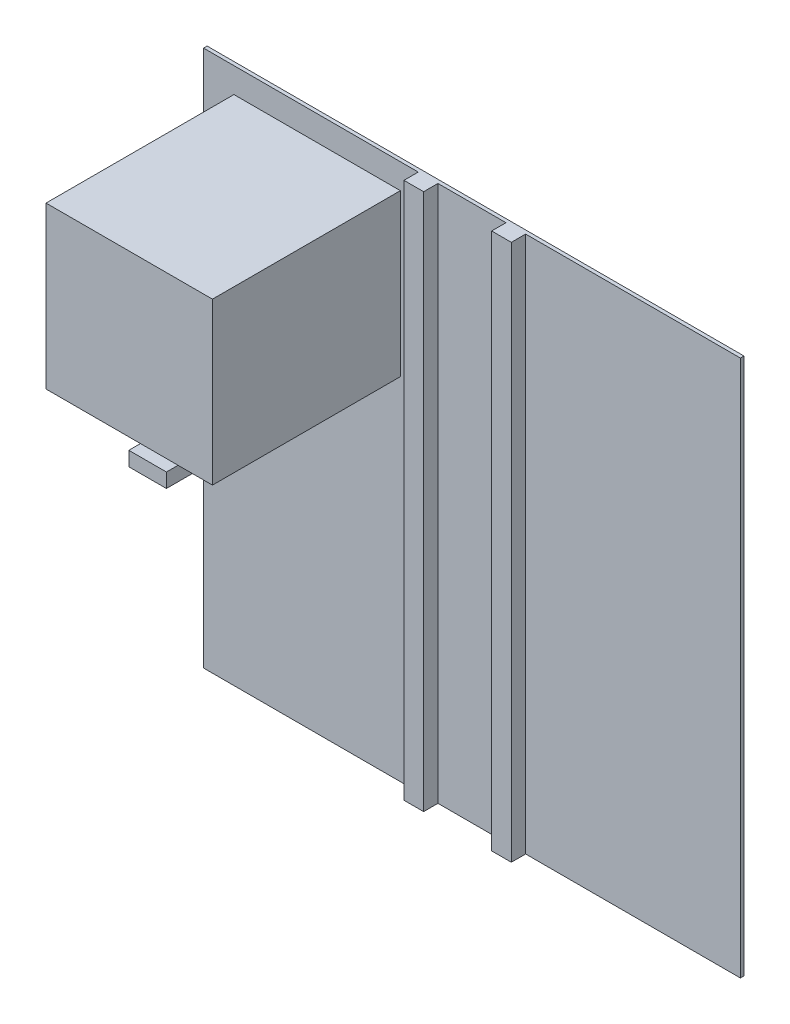
ISO-10303-21;
HEADER;
FILE_DESCRIPTION(('STEP AP214'),'2;1');
FILE_NAME('part.step','',(''),(''),'','','');
FILE_SCHEMA(('AUTOMOTIVE_DESIGN { 1 0 10303 214 1 1 1 1 }'));
ENDSEC;
DATA;
#1=APPLICATION_CONTEXT('core data for automotive mechanical design processes');
#2=APPLICATION_PROTOCOL_DEFINITION('international standard','automotive_design',2000,#1);
#3=PRODUCT_CONTEXT('',#1,'mechanical');
#4=PRODUCT('Part','Part','',(#3));
#5=PRODUCT_RELATED_PRODUCT_CATEGORY('part','',(#4));
#6=PRODUCT_DEFINITION_FORMATION('','',#4);
#7=PRODUCT_DEFINITION_CONTEXT('part definition',#1,'design');
#8=PRODUCT_DEFINITION('design','',#6,#7);
#9=PRODUCT_DEFINITION_SHAPE('','',#8);
#10=(LENGTH_UNIT() NAMED_UNIT(*) SI_UNIT(.MILLI.,.METRE.));
#11=(NAMED_UNIT(*) PLANE_ANGLE_UNIT() SI_UNIT($,.RADIAN.));
#12=(NAMED_UNIT(*) SI_UNIT($,.STERADIAN.) SOLID_ANGLE_UNIT());
#13=UNCERTAINTY_MEASURE_WITH_UNIT(LENGTH_MEASURE(1.E-05),#10,'distance_accuracy_value','');
#14=(GEOMETRIC_REPRESENTATION_CONTEXT(3) GLOBAL_UNCERTAINTY_ASSIGNED_CONTEXT((#13)) GLOBAL_UNIT_ASSIGNED_CONTEXT((#10,
#11,#12)) REPRESENTATION_CONTEXT('',''));
#15=CARTESIAN_POINT('',(0.,0.,0.));
#16=DIRECTION('',(0.,0.,1.));
#17=DIRECTION('',(1.,0.,0.));
#18=AXIS2_PLACEMENT_3D('',#15,#16,#17);
#19=CARTESIAN_POINT('',(0.,0.,10.));
#20=DIRECTION('',(0.,0.,1.));
#21=DIRECTION('',(1.,0.,0.));
#22=AXIS2_PLACEMENT_3D('',#19,#20,#21);
#23=PLANE('',#22);
#24=DIRECTION('',(-1.,0.,0.));
#25=VECTOR('',#24,1.);
#26=CARTESIAN_POINT('',(-1500.,1500.,10.));
#27=LINE('',#26,#25);
#28=CARTESIAN_POINT('',(-2.22044604925031E-13,1500.,10.));
#29=VERTEX_POINT('',#28);
#30=CARTESIAN_POINT('',(-600.,1500.,10.));
#31=VERTEX_POINT('',#30);
#32=EDGE_CURVE('E216',#29,#31,#27,.T.);
#33=ORIENTED_EDGE('',*,*,#32,.T.);
#34=DIRECTION('',(0.,1.,0.));
#35=VECTOR('',#34,1.);
#36=CARTESIAN_POINT('',(-600.,1500.,10.));
#37=LINE('',#36,#35);
#38=CARTESIAN_POINT('',(-600.,0.,10.));
#39=VERTEX_POINT('',#38);
#40=EDGE_CURVE('E54',#39,#31,#37,.T.);
#41=ORIENTED_EDGE('',*,*,#40,.F.);
#42=DIRECTION('',(1.,0.,0.));
#43=VECTOR('',#42,1.);
#44=CARTESIAN_POINT('',(-1500.,0.,10.));
#45=LINE('',#44,#43);
#46=CARTESIAN_POINT('',(0.,0.,10.));
#47=VERTEX_POINT('',#46);
#48=EDGE_CURVE('E361',#39,#47,#45,.T.);
#49=ORIENTED_EDGE('',*,*,#48,.T.);
#50=DIRECTION('',(0.,1.,0.));
#51=VECTOR('',#50,1.);
#52=CARTESIAN_POINT('',(-2.22044604925031E-13,1500.,10.));
#53=LINE('',#52,#51);
#54=EDGE_CURVE('E365',#47,#29,#53,.T.);
#55=ORIENTED_EDGE('',*,*,#54,.T.);
#56=EDGE_LOOP('',(#33,#41,#49,#55));
#57=FACE_BOUND('',#56,.T.);
#58=ADVANCED_FACE('F39',(#57),#23,.T.);
#59=CARTESIAN_POINT('',(-845.,0.,10.));
#60=VERTEX_POINT('',#59);
#61=CARTESIAN_POINT('',(-655.,0.,10.));
#62=VERTEX_POINT('',#61);
#63=EDGE_CURVE('E62',#60,#62,#45,.T.);
#64=ORIENTED_EDGE('',*,*,#63,.T.);
#65=DIRECTION('',(0.,-1.,0.));
#66=VECTOR('',#65,1.);
#67=CARTESIAN_POINT('',(-655.,1500.,10.));
#68=LINE('',#67,#66);
#69=CARTESIAN_POINT('',(-655.,1500.,10.));
#70=VERTEX_POINT('',#69);
#71=EDGE_CURVE('E219',#70,#62,#68,.T.);
#72=ORIENTED_EDGE('',*,*,#71,.F.);
#73=CARTESIAN_POINT('',(-845.,1500.,10.));
#74=VERTEX_POINT('',#73);
#75=EDGE_CURVE('E207',#70,#74,#27,.T.);
#76=ORIENTED_EDGE('',*,*,#75,.T.);
#77=DIRECTION('',(0.,1.,0.));
#78=VECTOR('',#77,1.);
#79=CARTESIAN_POINT('',(-845.,1500.,10.));
#80=LINE('',#79,#78);
#81=EDGE_CURVE('E251',#60,#74,#80,.T.);
#82=ORIENTED_EDGE('',*,*,#81,.F.);
#83=EDGE_LOOP('',(#64,#72,#76,#82));
#84=FACE_BOUND('',#83,.T.);
#85=ADVANCED_FACE('F220',(#84),#23,.T.);
#86=DIRECTION('',(1.,0.,0.));
#87=VECTOR('',#86,1.);
#88=CARTESIAN_POINT('',(-1151.1239217096,940.,10.));
#89=LINE('',#88,#87);
#90=CARTESIAN_POINT('',(-1151.1239217096,940.,10.));
#91=VERTEX_POINT('',#90);
#92=CARTESIAN_POINT('',(-1046.1239217096,940.,10.));
#93=VERTEX_POINT('',#92);
#94=EDGE_CURVE('E299',#91,#93,#89,.T.);
#95=ORIENTED_EDGE('',*,*,#94,.F.);
#96=DIRECTION('',(0.,1.,0.));
#97=VECTOR('',#96,1.);
#98=CARTESIAN_POINT('',(-1151.1239217096,940.,10.));
#99=LINE('',#98,#97);
#100=CARTESIAN_POINT('',(-1151.1239217096,980.,10.));
#101=VERTEX_POINT('',#100);
#102=EDGE_CURVE('E317',#91,#101,#99,.T.);
#103=ORIENTED_EDGE('',*,*,#102,.T.);
#104=DIRECTION('',(1.,0.,0.));
#105=VECTOR('',#104,1.);
#106=CARTESIAN_POINT('',(-1415.,980.,10.));
#107=LINE('',#106,#105);
#108=CARTESIAN_POINT('',(-1415.,980.,10.));
#109=VERTEX_POINT('',#108);
#110=EDGE_CURVE('E341',#109,#101,#107,.T.);
#111=ORIENTED_EDGE('',*,*,#110,.F.);
#112=DIRECTION('',(0.,-1.,0.));
#113=VECTOR('',#112,1.);
#114=CARTESIAN_POINT('',(-1415.,1430.,10.));
#115=LINE('',#114,#113);
#116=CARTESIAN_POINT('',(-1415.,1430.,10.));
#117=VERTEX_POINT('',#116);
#118=EDGE_CURVE('E316',#117,#109,#115,.T.);
#119=ORIENTED_EDGE('',*,*,#118,.F.);
#120=DIRECTION('',(-1.,0.,0.));
#121=VECTOR('',#120,1.);
#122=CARTESIAN_POINT('',(-1415.,1430.,10.));
#123=LINE('',#122,#121);
#124=CARTESIAN_POINT('',(-950.000000000001,1430.,10.));
#125=VERTEX_POINT('',#124);
#126=EDGE_CURVE('E328',#125,#117,#123,.T.);
#127=ORIENTED_EDGE('',*,*,#126,.F.);
#128=DIRECTION('',(0.,1.,0.));
#129=VECTOR('',#128,1.);
#130=CARTESIAN_POINT('',(-950.000000000001,1430.,10.));
#131=LINE('',#130,#129);
#132=CARTESIAN_POINT('',(-950.000000000001,980.,10.));
#133=VERTEX_POINT('',#132);
#134=EDGE_CURVE('E344',#133,#125,#131,.T.);
#135=ORIENTED_EDGE('',*,*,#134,.F.);
#136=CARTESIAN_POINT('',(-1046.1239217096,980.,10.));
#137=VERTEX_POINT('',#136);
#138=EDGE_CURVE('E340',#137,#133,#107,.T.);
#139=ORIENTED_EDGE('',*,*,#138,.F.);
#140=DIRECTION('',(0.,1.,0.));
#141=VECTOR('',#140,1.);
#142=CARTESIAN_POINT('',(-1046.1239217096,940.,10.));
#143=LINE('',#142,#141);
#144=EDGE_CURVE('E320',#93,#137,#143,.T.);
#145=ORIENTED_EDGE('',*,*,#144,.F.);
#146=EDGE_LOOP('',(#95,#103,#111,#119,#127,#135,#139,#145));
#147=FACE_BOUND('',#146,.T.);
#148=CARTESIAN_POINT('',(-1500.,0.,10.));
#149=VERTEX_POINT('',#148);
#150=CARTESIAN_POINT('',(-900.,0.,10.));
#151=VERTEX_POINT('',#150);
#152=EDGE_CURVE('E363',#149,#151,#45,.T.);
#153=ORIENTED_EDGE('',*,*,#152,.T.);
#154=DIRECTION('',(0.,-1.,0.));
#155=VECTOR('',#154,1.);
#156=CARTESIAN_POINT('',(-900.,1500.,10.));
#157=LINE('',#156,#155);
#158=CARTESIAN_POINT('',(-900.,1500.,10.));
#159=VERTEX_POINT('',#158);
#160=EDGE_CURVE('E240',#159,#151,#157,.T.);
#161=ORIENTED_EDGE('',*,*,#160,.F.);
#162=CARTESIAN_POINT('',(-1500.,1500.,10.));
#163=VERTEX_POINT('',#162);
#164=EDGE_CURVE('E217',#159,#163,#27,.T.);
#165=ORIENTED_EDGE('',*,*,#164,.T.);
#166=DIRECTION('',(0.,-1.,0.));
#167=VECTOR('',#166,1.);
#168=CARTESIAN_POINT('',(-1500.,1500.,10.));
#169=LINE('',#168,#167);
#170=EDGE_CURVE('E358',#163,#149,#169,.T.);
#171=ORIENTED_EDGE('',*,*,#170,.T.);
#172=EDGE_LOOP('',(#153,#161,#165,#171));
#173=FACE_BOUND('',#172,.T.);
#174=ADVANCED_FACE('F409',(#147,#173),#23,.T.);
#175=CARTESIAN_POINT('',(0.,940.,0.));
#176=DIRECTION('',(0.,1.,0.));
#177=DIRECTION('',(0.,0.,1.));
#178=AXIS2_PLACEMENT_3D('',#175,#176,#177);
#179=PLANE('',#178);
#180=CARTESIAN_POINT('',(-1098.6239217096,940.,272.5));
#181=DIRECTION('',(0.,1.,0.));
#182=DIRECTION('',(0.,0.,1.));
#183=AXIS2_PLACEMENT_3D('',#180,#181,#182);
#184=CIRCLE('',#183,84.9999999999999);
#185=CARTESIAN_POINT('',(-1046.1239217096,940.,339.348709785605));
#186=VERTEX_POINT('',#185);
#187=CARTESIAN_POINT('',(-1151.1239217096,940.,339.348709785605));
#188=VERTEX_POINT('',#187);
#189=EDGE_CURVE('E11',#186,#188,#184,.F.);
#190=ORIENTED_EDGE('',*,*,#189,.F.);
#191=DIRECTION('',(0.,0.,-1.));
#192=VECTOR('',#191,1.);
#193=CARTESIAN_POINT('',(-1046.1239217096,940.,567.5));
#194=LINE('',#193,#192);
#195=CARTESIAN_POINT('',(-1046.1239217096,940.,567.5));
#196=VERTEX_POINT('',#195);
#197=EDGE_CURVE('E296',#196,#186,#194,.T.);
#198=ORIENTED_EDGE('',*,*,#197,.F.);
#199=DIRECTION('',(1.,0.,0.));
#200=VECTOR('',#199,1.);
#201=CARTESIAN_POINT('',(-1151.1239217096,940.,567.5));
#202=LINE('',#201,#200);
#203=CARTESIAN_POINT('',(-1151.1239217096,940.,567.5));
#204=VERTEX_POINT('',#203);
#205=EDGE_CURVE('E291',#204,#196,#202,.T.);
#206=ORIENTED_EDGE('',*,*,#205,.F.);
#207=DIRECTION('',(0.,0.,-1.));
#208=VECTOR('',#207,1.);
#209=CARTESIAN_POINT('',(-1151.1239217096,940.,567.5));
#210=LINE('',#209,#208);
#211=EDGE_CURVE('E303',#204,#188,#210,.T.);
#212=ORIENTED_EDGE('',*,*,#211,.T.);
#213=EDGE_LOOP('',(#190,#198,#206,#212));
#214=FACE_BOUND('',#213,.T.);
#215=ADVANCED_FACE('F462',(#214),#179,.F.);
#216=CARTESIAN_POINT('',(-1415.,980.,535.));
#217=DIRECTION('',(0.,1.,0.));
#218=DIRECTION('',(0.,0.,1.));
#219=AXIS2_PLACEMENT_3D('',#216,#217,#218);
#220=PLANE('',#219);
#221=DIRECTION('',(0.,0.,-1.));
#222=VECTOR('',#221,1.);
#223=CARTESIAN_POINT('',(-1151.1239217096,980.,567.5));
#224=LINE('',#223,#222);
#225=CARTESIAN_POINT('',(-1151.1239217096,980.,535.));
#226=VERTEX_POINT('',#225);
#227=EDGE_CURVE('E311',#226,#101,#224,.T.);
#228=ORIENTED_EDGE('',*,*,#227,.F.);
#229=DIRECTION('',(1.,0.,0.));
#230=VECTOR('',#229,1.);
#231=CARTESIAN_POINT('',(-1415.,980.,535.));
#232=LINE('',#231,#230);
#233=CARTESIAN_POINT('',(-1415.,980.,535.));
#234=VERTEX_POINT('',#233);
#235=EDGE_CURVE('E329',#234,#226,#232,.T.);
#236=ORIENTED_EDGE('',*,*,#235,.F.);
#237=DIRECTION('',(0.,0.,-1.));
#238=VECTOR('',#237,1.);
#239=CARTESIAN_POINT('',(-1415.,980.,535.));
#240=LINE('',#239,#238);
#241=EDGE_CURVE('E355',#234,#109,#240,.T.);
#242=ORIENTED_EDGE('',*,*,#241,.T.);
#243=ORIENTED_EDGE('',*,*,#110,.T.);
#244=EDGE_LOOP('',(#228,#236,#242,#243));
#245=FACE_BOUND('',#244,.T.);
#246=ADVANCED_FACE('F429',(#245),#220,.F.);
#247=CARTESIAN_POINT('',(-1500.,1500.,10.));
#248=DIRECTION('',(1.,0.,0.));
#249=DIRECTION('',(0.,0.,-1.));
#250=AXIS2_PLACEMENT_3D('',#247,#248,#249);
#251=PLANE('',#250);
#252=DIRECTION('',(0.,-1.,0.));
#253=VECTOR('',#252,1.);
#254=CARTESIAN_POINT('',(-1500.,1500.,0.));
#255=LINE('',#254,#253);
#256=CARTESIAN_POINT('',(-1500.,1500.,0.));
#257=VERTEX_POINT('',#256);
#258=CARTESIAN_POINT('',(-1500.,0.,0.));
#259=VERTEX_POINT('',#258);
#260=EDGE_CURVE('E357',#257,#259,#255,.T.);
#261=ORIENTED_EDGE('',*,*,#260,.T.);
#262=DIRECTION('',(0.,0.,-1.));
#263=VECTOR('',#262,1.);
#264=CARTESIAN_POINT('',(-1500.,0.,10.));
#265=LINE('',#264,#263);
#266=EDGE_CURVE('E383',#149,#259,#265,.T.);
#267=ORIENTED_EDGE('',*,*,#266,.F.);
#268=ORIENTED_EDGE('',*,*,#170,.F.);
#269=DIRECTION('',(0.,0.,-1.));
#270=VECTOR('',#269,1.);
#271=CARTESIAN_POINT('',(-1500.,1500.,10.));
#272=LINE('',#271,#270);
#273=EDGE_CURVE('E367',#163,#257,#272,.T.);
#274=ORIENTED_EDGE('',*,*,#273,.T.);
#275=EDGE_LOOP('',(#261,#267,#268,#274));
#276=FACE_BOUND('',#275,.T.);
#277=ADVANCED_FACE('F41',(#276),#251,.F.);
#278=CARTESIAN_POINT('',(-1500.,0.,10.));
#279=DIRECTION('',(0.,1.,0.));
#280=DIRECTION('',(0.,0.,1.));
#281=AXIS2_PLACEMENT_3D('',#278,#279,#280);
#282=PLANE('',#281);
#283=DIRECTION('',(1.,0.,0.));
#284=VECTOR('',#283,1.);
#285=CARTESIAN_POINT('',(-1500.,0.,0.));
#286=LINE('',#285,#284);
#287=CARTESIAN_POINT('',(0.,0.,0.));
#288=VERTEX_POINT('',#287);
#289=EDGE_CURVE('E370',#259,#288,#286,.T.);
#290=ORIENTED_EDGE('',*,*,#289,.T.);
#291=DIRECTION('',(0.,0.,-1.));
#292=VECTOR('',#291,1.);
#293=CARTESIAN_POINT('',(0.,0.,10.));
#294=LINE('',#293,#292);
#295=EDGE_CURVE('E380',#47,#288,#294,.T.);
#296=ORIENTED_EDGE('',*,*,#295,.F.);
#297=ORIENTED_EDGE('',*,*,#48,.F.);
#298=DIRECTION('',(0.,0.,-1.));
#299=VECTOR('',#298,1.);
#300=CARTESIAN_POINT('',(-600.,0.,50.));
#301=LINE('',#300,#299);
#302=CARTESIAN_POINT('',(-600.,0.,50.));
#303=VERTEX_POINT('',#302);
#304=EDGE_CURVE('E231',#303,#39,#301,.T.);
#305=ORIENTED_EDGE('',*,*,#304,.F.);
#306=DIRECTION('',(1.,0.,0.));
#307=VECTOR('',#306,1.);
#308=CARTESIAN_POINT('',(-600.,0.,50.));
#309=LINE('',#308,#307);
#310=CARTESIAN_POINT('',(-655.,0.,50.));
#311=VERTEX_POINT('',#310);
#312=EDGE_CURVE('E237',#311,#303,#309,.T.);
#313=ORIENTED_EDGE('',*,*,#312,.F.);
#314=DIRECTION('',(0.,0.,-1.));
#315=VECTOR('',#314,1.);
#316=CARTESIAN_POINT('',(-655.,0.,50.));
#317=LINE('',#316,#315);
#318=EDGE_CURVE('E228',#311,#62,#317,.T.);
#319=ORIENTED_EDGE('',*,*,#318,.T.);
#320=ORIENTED_EDGE('',*,*,#63,.F.);
#321=DIRECTION('',(0.,0.,-1.));
#322=VECTOR('',#321,1.);
#323=CARTESIAN_POINT('',(-845.,0.,50.));
#324=LINE('',#323,#322);
#325=CARTESIAN_POINT('',(-845.,0.,50.));
#326=VERTEX_POINT('',#325);
#327=EDGE_CURVE('E264',#326,#60,#324,.T.);
#328=ORIENTED_EDGE('',*,*,#327,.F.);
#329=DIRECTION('',(1.,0.,0.));
#330=VECTOR('',#329,1.);
#331=CARTESIAN_POINT('',(-900.,0.,50.));
#332=LINE('',#331,#330);
#333=CARTESIAN_POINT('',(-900.,0.,50.));
#334=VERTEX_POINT('',#333);
#335=EDGE_CURVE('E250',#334,#326,#332,.T.);
#336=ORIENTED_EDGE('',*,*,#335,.F.);
#337=DIRECTION('',(0.,0.,-1.));
#338=VECTOR('',#337,1.);
#339=CARTESIAN_POINT('',(-900.,0.,50.));
#340=LINE('',#339,#338);
#341=EDGE_CURVE('E267',#334,#151,#340,.T.);
#342=ORIENTED_EDGE('',*,*,#341,.T.);
#343=ORIENTED_EDGE('',*,*,#152,.F.);
#344=ORIENTED_EDGE('',*,*,#266,.T.);
#345=EDGE_LOOP('',(#290,#296,#297,#305,#313,#319,#320,#328,#336,#342,#343,#344));
#346=FACE_BOUND('',#345,.T.);
#347=ADVANCED_FACE('F570',(#346),#282,.F.);
#348=CARTESIAN_POINT('',(-2.22044604925031E-13,1500.,10.));
#349=DIRECTION('',(-1.,0.,0.));
#350=DIRECTION('',(0.,-1.,0.));
#351=AXIS2_PLACEMENT_3D('',#348,#349,#350);
#352=PLANE('',#351);
#353=DIRECTION('',(0.,1.,0.));
#354=VECTOR('',#353,1.);
#355=CARTESIAN_POINT('',(-2.22044604925031E-13,1500.,0.));
#356=LINE('',#355,#354);
#357=CARTESIAN_POINT('',(-2.22044604925031E-13,1500.,0.));
#358=VERTEX_POINT('',#357);
#359=EDGE_CURVE('E372',#288,#358,#356,.T.);
#360=ORIENTED_EDGE('',*,*,#359,.T.);
#361=DIRECTION('',(0.,0.,-1.));
#362=VECTOR('',#361,1.);
#363=CARTESIAN_POINT('',(-2.22044604925031E-13,1500.,10.));
#364=LINE('',#363,#362);
#365=EDGE_CURVE('E377',#29,#358,#364,.T.);
#366=ORIENTED_EDGE('',*,*,#365,.F.);
#367=ORIENTED_EDGE('',*,*,#54,.F.);
#368=ORIENTED_EDGE('',*,*,#295,.T.);
#369=EDGE_LOOP('',(#360,#366,#367,#368));
#370=FACE_BOUND('',#369,.T.);
#371=ADVANCED_FACE('F575',(#370),#352,.F.);
#372=CARTESIAN_POINT('',(-1500.,1500.,10.));
#373=DIRECTION('',(0.,-1.,0.));
#374=DIRECTION('',(1.,0.,0.));
#375=AXIS2_PLACEMENT_3D('',#372,#373,#374);
#376=PLANE('',#375);
#377=DIRECTION('',(-1.,0.,0.));
#378=VECTOR('',#377,1.);
#379=CARTESIAN_POINT('',(-1500.,1500.,0.));
#380=LINE('',#379,#378);
#381=EDGE_CURVE('E362',#358,#257,#380,.T.);
#382=ORIENTED_EDGE('',*,*,#381,.T.);
#383=ORIENTED_EDGE('',*,*,#273,.F.);
#384=ORIENTED_EDGE('',*,*,#164,.F.);
#385=DIRECTION('',(0.,0.,-1.));
#386=VECTOR('',#385,1.);
#387=CARTESIAN_POINT('',(-900.,1500.,50.));
#388=LINE('',#387,#386);
#389=CARTESIAN_POINT('',(-900.,1500.,50.));
#390=VERTEX_POINT('',#389);
#391=EDGE_CURVE('E257',#390,#159,#388,.T.);
#392=ORIENTED_EDGE('',*,*,#391,.F.);
#393=DIRECTION('',(-1.,0.,0.));
#394=VECTOR('',#393,1.);
#395=CARTESIAN_POINT('',(-900.,1500.,50.));
#396=LINE('',#395,#394);
#397=CARTESIAN_POINT('',(-845.,1500.,50.));
#398=VERTEX_POINT('',#397);
#399=EDGE_CURVE('E255',#398,#390,#396,.T.);
#400=ORIENTED_EDGE('',*,*,#399,.F.);
#401=DIRECTION('',(0.,0.,-1.));
#402=VECTOR('',#401,1.);
#403=CARTESIAN_POINT('',(-845.,1500.,50.));
#404=LINE('',#403,#402);
#405=EDGE_CURVE('E214',#398,#74,#404,.T.);
#406=ORIENTED_EDGE('',*,*,#405,.T.);
#407=ORIENTED_EDGE('',*,*,#75,.F.);
#408=DIRECTION('',(0.,0.,-1.));
#409=VECTOR('',#408,1.);
#410=CARTESIAN_POINT('',(-655.,1500.,50.));
#411=LINE('',#410,#409);
#412=CARTESIAN_POINT('',(-655.,1500.,50.));
#413=VERTEX_POINT('',#412);
#414=EDGE_CURVE('E210',#413,#70,#411,.T.);
#415=ORIENTED_EDGE('',*,*,#414,.F.);
#416=DIRECTION('',(-1.,0.,0.));
#417=VECTOR('',#416,1.);
#418=CARTESIAN_POINT('',(-600.,1500.,50.));
#419=LINE('',#418,#417);
#420=CARTESIAN_POINT('',(-600.,1500.,50.));
#421=VERTEX_POINT('',#420);
#422=EDGE_CURVE('E243',#421,#413,#419,.T.);
#423=ORIENTED_EDGE('',*,*,#422,.F.);
#424=DIRECTION('',(0.,0.,-1.));
#425=VECTOR('',#424,1.);
#426=CARTESIAN_POINT('',(-600.,1500.,50.));
#427=LINE('',#426,#425);
#428=EDGE_CURVE('E229',#421,#31,#427,.T.);
#429=ORIENTED_EDGE('',*,*,#428,.T.);
#430=ORIENTED_EDGE('',*,*,#32,.F.);
#431=ORIENTED_EDGE('',*,*,#365,.T.);
#432=EDGE_LOOP('',(#382,#383,#384,#392,#400,#406,#407,#415,#423,#429,#430,#431));
#433=FACE_BOUND('',#432,.T.);
#434=ADVANCED_FACE('F208',(#433),#376,.F.);
#435=CARTESIAN_POINT('',(0.,0.,0.));
#436=DIRECTION('',(0.,0.,1.));
#437=DIRECTION('',(1.,0.,0.));
#438=AXIS2_PLACEMENT_3D('',#435,#436,#437);
#439=PLANE('',#438);
#440=ORIENTED_EDGE('',*,*,#260,.F.);
#441=ORIENTED_EDGE('',*,*,#381,.F.);
#442=ORIENTED_EDGE('',*,*,#359,.F.);
#443=ORIENTED_EDGE('',*,*,#289,.F.);
#444=EDGE_LOOP('',(#440,#441,#442,#443));
#445=FACE_BOUND('',#444,.T.);
#446=ADVANCED_FACE('F591',(#445),#439,.F.);
#447=CARTESIAN_POINT('',(-1415.,1430.,535.));
#448=DIRECTION('',(1.,0.,0.));
#449=DIRECTION('',(0.,0.,-1.));
#450=AXIS2_PLACEMENT_3D('',#447,#448,#449);
#451=PLANE('',#450);
#452=ORIENTED_EDGE('',*,*,#118,.T.);
#453=ORIENTED_EDGE('',*,*,#241,.F.);
#454=DIRECTION('',(0.,-1.,0.));
#455=VECTOR('',#454,1.);
#456=CARTESIAN_POINT('',(-1415.,1430.,535.));
#457=LINE('',#456,#455);
#458=CARTESIAN_POINT('',(-1415.,1430.,535.));
#459=VERTEX_POINT('',#458);
#460=EDGE_CURVE('E324',#459,#234,#457,.T.);
#461=ORIENTED_EDGE('',*,*,#460,.F.);
#462=DIRECTION('',(0.,0.,-1.));
#463=VECTOR('',#462,1.);
#464=CARTESIAN_POINT('',(-1415.,1430.,535.));
#465=LINE('',#464,#463);
#466=EDGE_CURVE('E337',#459,#117,#465,.T.);
#467=ORIENTED_EDGE('',*,*,#466,.T.);
#468=EDGE_LOOP('',(#452,#453,#461,#467));
#469=FACE_BOUND('',#468,.T.);
#470=ADVANCED_FACE('F435',(#469),#451,.F.);
#471=CARTESIAN_POINT('',(-1046.1239217096,980.,535.));
#472=VERTEX_POINT('',#471);
#473=CARTESIAN_POINT('',(-950.000000000001,980.,535.));
#474=VERTEX_POINT('',#473);
#475=EDGE_CURVE('E327',#472,#474,#232,.T.);
#476=ORIENTED_EDGE('',*,*,#475,.F.);
#477=DIRECTION('',(0.,0.,-1.));
#478=VECTOR('',#477,1.);
#479=CARTESIAN_POINT('',(-1046.1239217096,980.,567.5));
#480=LINE('',#479,#478);
#481=EDGE_CURVE('E308',#472,#137,#480,.T.);
#482=ORIENTED_EDGE('',*,*,#481,.T.);
#483=ORIENTED_EDGE('',*,*,#138,.T.);
#484=DIRECTION('',(0.,0.,-1.));
#485=VECTOR('',#484,1.);
#486=CARTESIAN_POINT('',(-950.000000000001,980.,535.));
#487=LINE('',#486,#485);
#488=EDGE_CURVE('E352',#474,#133,#487,.T.);
#489=ORIENTED_EDGE('',*,*,#488,.F.);
#490=EDGE_LOOP('',(#476,#482,#483,#489));
#491=FACE_BOUND('',#490,.T.);
#492=ADVANCED_FACE('F418',(#491),#220,.F.);
#493=CARTESIAN_POINT('',(-950.000000000001,1430.,535.));
#494=DIRECTION('',(-1.,0.,0.));
#495=DIRECTION('',(0.,0.,1.));
#496=AXIS2_PLACEMENT_3D('',#493,#494,#495);
#497=PLANE('',#496);
#498=ORIENTED_EDGE('',*,*,#134,.T.);
#499=DIRECTION('',(0.,0.,-1.));
#500=VECTOR('',#499,1.);
#501=CARTESIAN_POINT('',(-950.000000000001,1430.,535.));
#502=LINE('',#501,#500);
#503=CARTESIAN_POINT('',(-950.000000000001,1430.,535.));
#504=VERTEX_POINT('',#503);
#505=EDGE_CURVE('E350',#504,#125,#502,.T.);
#506=ORIENTED_EDGE('',*,*,#505,.F.);
#507=DIRECTION('',(0.,1.,0.));
#508=VECTOR('',#507,1.);
#509=CARTESIAN_POINT('',(-950.000000000001,1430.,535.));
#510=LINE('',#509,#508);
#511=EDGE_CURVE('E332',#474,#504,#510,.T.);
#512=ORIENTED_EDGE('',*,*,#511,.F.);
#513=ORIENTED_EDGE('',*,*,#488,.T.);
#514=EDGE_LOOP('',(#498,#506,#512,#513));
#515=FACE_BOUND('',#514,.T.);
#516=ADVANCED_FACE('F443',(#515),#497,.F.);
#517=CARTESIAN_POINT('',(-1415.,1430.,535.));
#518=DIRECTION('',(0.,-1.,0.));
#519=DIRECTION('',(0.,0.,-1.));
#520=AXIS2_PLACEMENT_3D('',#517,#518,#519);
#521=PLANE('',#520);
#522=ORIENTED_EDGE('',*,*,#126,.T.);
#523=ORIENTED_EDGE('',*,*,#466,.F.);
#524=DIRECTION('',(-1.,0.,0.));
#525=VECTOR('',#524,1.);
#526=CARTESIAN_POINT('',(-1415.,1430.,535.));
#527=LINE('',#526,#525);
#528=EDGE_CURVE('E335',#504,#459,#527,.T.);
#529=ORIENTED_EDGE('',*,*,#528,.F.);
#530=ORIENTED_EDGE('',*,*,#505,.T.);
#531=EDGE_LOOP('',(#522,#523,#529,#530));
#532=FACE_BOUND('',#531,.T.);
#533=ADVANCED_FACE('F440',(#532),#521,.F.);
#534=CARTESIAN_POINT('',(0.,0.,535.));
#535=DIRECTION('',(0.,0.,1.));
#536=DIRECTION('',(1.,0.,0.));
#537=AXIS2_PLACEMENT_3D('',#534,#535,#536);
#538=PLANE('',#537);
#539=ORIENTED_EDGE('',*,*,#460,.T.);
#540=ORIENTED_EDGE('',*,*,#235,.T.);
#541=EDGE_CURVE('E333',#226,#472,#232,.T.);
#542=ORIENTED_EDGE('',*,*,#541,.T.);
#543=ORIENTED_EDGE('',*,*,#475,.T.);
#544=ORIENTED_EDGE('',*,*,#511,.T.);
#545=ORIENTED_EDGE('',*,*,#528,.T.);
#546=EDGE_LOOP('',(#539,#540,#542,#543,#544,#545));
#547=FACE_BOUND('',#546,.T.);
#548=ADVANCED_FACE('F421',(#547),#538,.T.);
#549=CARTESIAN_POINT('',(-1151.1239217096,940.,567.5));
#550=DIRECTION('',(0.,0.,1.));
#551=DIRECTION('',(1.,0.,0.));
#552=AXIS2_PLACEMENT_3D('',#549,#550,#551);
#553=PLANE('',#552);
#554=DIRECTION('',(1.,0.,0.));
#555=VECTOR('',#554,1.);
#556=CARTESIAN_POINT('',(-1151.1239217096,980.,567.5));
#557=LINE('',#556,#555);
#558=CARTESIAN_POINT('',(-1151.1239217096,980.,567.5));
#559=VERTEX_POINT('',#558);
#560=CARTESIAN_POINT('',(-1046.1239217096,980.,567.5));
#561=VERTEX_POINT('',#560);
#562=EDGE_CURVE('E290',#559,#561,#557,.T.);
#563=ORIENTED_EDGE('',*,*,#562,.F.);
#564=DIRECTION('',(0.,1.,0.));
#565=VECTOR('',#564,1.);
#566=CARTESIAN_POINT('',(-1151.1239217096,940.,567.5));
#567=LINE('',#566,#565);
#568=EDGE_CURVE('E314',#204,#559,#567,.T.);
#569=ORIENTED_EDGE('',*,*,#568,.F.);
#570=ORIENTED_EDGE('',*,*,#205,.T.);
#571=DIRECTION('',(0.,1.,0.));
#572=VECTOR('',#571,1.);
#573=CARTESIAN_POINT('',(-1046.1239217096,940.,567.5));
#574=LINE('',#573,#572);
#575=EDGE_CURVE('E305',#196,#561,#574,.T.);
#576=ORIENTED_EDGE('',*,*,#575,.T.);
#577=EDGE_LOOP('',(#563,#569,#570,#576));
#578=FACE_BOUND('',#577,.T.);
#579=ADVANCED_FACE('F485',(#578),#553,.T.);
#580=CARTESIAN_POINT('',(-1151.1239217096,940.,567.5));
#581=DIRECTION('',(1.,0.,0.));
#582=DIRECTION('',(0.,0.,-1.));
#583=AXIS2_PLACEMENT_3D('',#580,#581,#582);
#584=PLANE('',#583);
#585=ORIENTED_EDGE('',*,*,#227,.T.);
#586=ORIENTED_EDGE('',*,*,#102,.F.);
#587=CARTESIAN_POINT('',(-1151.1239217096,940.,205.651290214395));
#588=VERTEX_POINT('',#587);
#589=EDGE_CURVE('E302',#588,#91,#210,.T.);
#590=ORIENTED_EDGE('',*,*,#589,.F.);
#591=DIRECTION('',(0.,1.,0.));
#592=VECTOR('',#591,1.);
#593=CARTESIAN_POINT('',(-1151.1239217096,915.,205.651290214395));
#594=LINE('',#593,#592);
#595=CARTESIAN_POINT('',(-1151.1239217096,915.,205.651290214395));
#596=VERTEX_POINT('',#595);
#597=EDGE_CURVE('E281',#596,#588,#594,.T.);
#598=ORIENTED_EDGE('',*,*,#597,.F.);
#599=DIRECTION('',(0.,0.,-1.));
#600=VECTOR('',#599,1.);
#601=CARTESIAN_POINT('',(-1151.1239217096,915.,0.));
#602=LINE('',#601,#600);
#603=CARTESIAN_POINT('',(-1151.1239217096,915.,339.348709785605));
#604=VERTEX_POINT('',#603);
#605=EDGE_CURVE('E275',#604,#596,#602,.T.);
#606=ORIENTED_EDGE('',*,*,#605,.F.);
#607=DIRECTION('',(0.,1.,0.));
#608=VECTOR('',#607,1.);
#609=CARTESIAN_POINT('',(-1151.1239217096,915.,339.348709785605));
#610=LINE('',#609,#608);
#611=EDGE_CURVE('E284',#604,#188,#610,.T.);
#612=ORIENTED_EDGE('',*,*,#611,.T.);
#613=ORIENTED_EDGE('',*,*,#211,.F.);
#614=ORIENTED_EDGE('',*,*,#568,.T.);
#615=EDGE_CURVE('E295',#559,#226,#224,.T.);
#616=ORIENTED_EDGE('',*,*,#615,.T.);
#617=EDGE_LOOP('',(#585,#586,#590,#598,#606,#612,#613,#614,#616));
#618=FACE_BOUND('',#617,.T.);
#619=ADVANCED_FACE('F402',(#618),#584,.F.);
#620=CARTESIAN_POINT('',(-1046.1239217096,940.,567.5));
#621=DIRECTION('',(1.,0.,0.));
#622=DIRECTION('',(0.,0.,-1.));
#623=AXIS2_PLACEMENT_3D('',#620,#621,#622);
#624=PLANE('',#623);
#625=ORIENTED_EDGE('',*,*,#144,.T.);
#626=ORIENTED_EDGE('',*,*,#481,.F.);
#627=EDGE_CURVE('E309',#561,#472,#480,.T.);
#628=ORIENTED_EDGE('',*,*,#627,.F.);
#629=ORIENTED_EDGE('',*,*,#575,.F.);
#630=ORIENTED_EDGE('',*,*,#197,.T.);
#631=DIRECTION('',(0.,1.,0.));
#632=VECTOR('',#631,1.);
#633=CARTESIAN_POINT('',(-1046.1239217096,915.,339.348709785605));
#634=LINE('',#633,#632);
#635=CARTESIAN_POINT('',(-1046.1239217096,915.,339.348709785605));
#636=VERTEX_POINT('',#635);
#637=EDGE_CURVE('E287',#636,#186,#634,.T.);
#638=ORIENTED_EDGE('',*,*,#637,.F.);
#639=DIRECTION('',(0.,0.,-1.));
#640=VECTOR('',#639,1.);
#641=CARTESIAN_POINT('',(-1046.1239217096,915.,-4.1665681237423E-13));
#642=LINE('',#641,#640);
#643=CARTESIAN_POINT('',(-1046.1239217096,915.,205.651290214396));
#644=VERTEX_POINT('',#643);
#645=EDGE_CURVE('E270',#636,#644,#642,.T.);
#646=ORIENTED_EDGE('',*,*,#645,.T.);
#647=DIRECTION('',(0.,1.,0.));
#648=VECTOR('',#647,1.);
#649=CARTESIAN_POINT('',(-1046.1239217096,915.,205.651290214396));
#650=LINE('',#649,#648);
#651=CARTESIAN_POINT('',(-1046.1239217096,940.,205.651290214396));
#652=VERTEX_POINT('',#651);
#653=EDGE_CURVE('E278',#644,#652,#650,.T.);
#654=ORIENTED_EDGE('',*,*,#653,.T.);
#655=EDGE_CURVE('E294',#652,#93,#194,.T.);
#656=ORIENTED_EDGE('',*,*,#655,.T.);
#657=EDGE_LOOP('',(#625,#626,#628,#629,#630,#638,#646,#654,#656));
#658=FACE_BOUND('',#657,.T.);
#659=ADVANCED_FACE('F394',(#658),#624,.T.);
#660=CARTESIAN_POINT('',(-1098.6239217096,940.,272.5));
#661=DIRECTION('',(0.,1.,0.));
#662=DIRECTION('',(0.,0.,1.));
#663=AXIS2_PLACEMENT_3D('',#660,#661,#662);
#664=CIRCLE('',#663,84.9999999999999);
#665=EDGE_CURVE('E47',#588,#652,#664,.F.);
#666=ORIENTED_EDGE('',*,*,#665,.F.);
#667=ORIENTED_EDGE('',*,*,#589,.T.);
#668=ORIENTED_EDGE('',*,*,#94,.T.);
#669=ORIENTED_EDGE('',*,*,#655,.F.);
#670=EDGE_LOOP('',(#666,#667,#668,#669));
#671=FACE_BOUND('',#670,.T.);
#672=ADVANCED_FACE('F405',(#671),#179,.F.);
#673=CARTESIAN_POINT('',(0.,980.,0.));
#674=DIRECTION('',(0.,1.,0.));
#675=DIRECTION('',(0.,0.,1.));
#676=AXIS2_PLACEMENT_3D('',#673,#674,#675);
#677=PLANE('',#676);
#678=ORIENTED_EDGE('',*,*,#627,.T.);
#679=ORIENTED_EDGE('',*,*,#541,.F.);
#680=ORIENTED_EDGE('',*,*,#615,.F.);
#681=ORIENTED_EDGE('',*,*,#562,.T.);
#682=EDGE_LOOP('',(#678,#679,#680,#681));
#683=FACE_BOUND('',#682,.T.);
#684=ADVANCED_FACE('F424',(#683),#677,.T.);
#685=CARTESIAN_POINT('',(-1098.6239217096,915.,272.5));
#686=DIRECTION('',(0.,1.,0.));
#687=DIRECTION('',(0.,0.,1.));
#688=AXIS2_PLACEMENT_3D('',#685,#686,#687);
#689=CYLINDRICAL_SURFACE('',#688,84.9999999999999);
#690=ORIENTED_EDGE('',*,*,#637,.T.);
#691=ORIENTED_EDGE('',*,*,#189,.T.);
#692=ORIENTED_EDGE('',*,*,#611,.F.);
#693=CARTESIAN_POINT('',(-1098.6239217096,915.,272.5));
#694=DIRECTION('',(0.,-1.,0.));
#695=DIRECTION('',(0.,0.,-1.));
#696=AXIS2_PLACEMENT_3D('',#693,#694,#695);
#697=CIRCLE('',#696,84.9999999999999);
#698=EDGE_CURVE('E273',#636,#604,#697,.T.);
#699=ORIENTED_EDGE('',*,*,#698,.F.);
#700=EDGE_LOOP('',(#690,#691,#692,#699));
#701=FACE_BOUND('',#700,.T.);
#702=ADVANCED_FACE('F480',(#701),#689,.T.);
#703=ORIENTED_EDGE('',*,*,#597,.T.);
#704=ORIENTED_EDGE('',*,*,#665,.T.);
#705=ORIENTED_EDGE('',*,*,#653,.F.);
#706=EDGE_CURVE('E276',#596,#644,#697,.T.);
#707=ORIENTED_EDGE('',*,*,#706,.F.);
#708=EDGE_LOOP('',(#703,#704,#705,#707));
#709=FACE_BOUND('',#708,.T.);
#710=ADVANCED_FACE('F388',(#709),#689,.T.);
#711=CARTESIAN_POINT('',(0.,915.,0.));
#712=DIRECTION('',(0.,-1.,0.));
#713=DIRECTION('',(0.,0.,-1.));
#714=AXIS2_PLACEMENT_3D('',#711,#712,#713);
#715=PLANE('',#714);
#716=ORIENTED_EDGE('',*,*,#645,.F.);
#717=ORIENTED_EDGE('',*,*,#698,.T.);
#718=ORIENTED_EDGE('',*,*,#605,.T.);
#719=ORIENTED_EDGE('',*,*,#706,.T.);
#720=EDGE_LOOP('',(#716,#717,#718,#719));
#721=FACE_BOUND('',#720,.T.);
#722=ADVANCED_FACE('F398',(#721),#715,.T.);
#723=CARTESIAN_POINT('',(-900.,1500.,50.));
#724=DIRECTION('',(1.,0.,0.));
#725=DIRECTION('',(0.,1.,0.));
#726=AXIS2_PLACEMENT_3D('',#723,#724,#725);
#727=PLANE('',#726);
#728=ORIENTED_EDGE('',*,*,#160,.T.);
#729=ORIENTED_EDGE('',*,*,#341,.F.);
#730=DIRECTION('',(0.,-1.,0.));
#731=VECTOR('',#730,1.);
#732=CARTESIAN_POINT('',(-900.,1500.,50.));
#733=LINE('',#732,#731);
#734=EDGE_CURVE('E247',#390,#334,#733,.T.);
#735=ORIENTED_EDGE('',*,*,#734,.F.);
#736=ORIENTED_EDGE('',*,*,#391,.T.);
#737=EDGE_LOOP('',(#728,#729,#735,#736));
#738=FACE_BOUND('',#737,.T.);
#739=ADVANCED_FACE('F551',(#738),#727,.F.);
#740=CARTESIAN_POINT('',(-845.,1500.,50.));
#741=DIRECTION('',(-1.,0.,0.));
#742=DIRECTION('',(0.,-1.,0.));
#743=AXIS2_PLACEMENT_3D('',#740,#741,#742);
#744=PLANE('',#743);
#745=ORIENTED_EDGE('',*,*,#81,.T.);
#746=ORIENTED_EDGE('',*,*,#405,.F.);
#747=DIRECTION('',(0.,1.,0.));
#748=VECTOR('',#747,1.);
#749=CARTESIAN_POINT('',(-845.,1500.,50.));
#750=LINE('',#749,#748);
#751=EDGE_CURVE('E253',#326,#398,#750,.T.);
#752=ORIENTED_EDGE('',*,*,#751,.F.);
#753=ORIENTED_EDGE('',*,*,#327,.T.);
#754=EDGE_LOOP('',(#745,#746,#752,#753));
#755=FACE_BOUND('',#754,.T.);
#756=ADVANCED_FACE('F605',(#755),#744,.F.);
#757=CARTESIAN_POINT('',(0.,0.,50.));
#758=DIRECTION('',(0.,0.,1.));
#759=DIRECTION('',(1.,0.,0.));
#760=AXIS2_PLACEMENT_3D('',#757,#758,#759);
#761=PLANE('',#760);
#762=ORIENTED_EDGE('',*,*,#734,.T.);
#763=ORIENTED_EDGE('',*,*,#335,.T.);
#764=ORIENTED_EDGE('',*,*,#751,.T.);
#765=ORIENTED_EDGE('',*,*,#399,.T.);
#766=EDGE_LOOP('',(#762,#763,#764,#765));
#767=FACE_BOUND('',#766,.T.);
#768=ADVANCED_FACE('F615',(#767),#761,.T.);
#769=CARTESIAN_POINT('',(-600.,1500.,50.));
#770=DIRECTION('',(-1.,0.,0.));
#771=DIRECTION('',(0.,-1.,0.));
#772=AXIS2_PLACEMENT_3D('',#769,#770,#771);
#773=PLANE('',#772);
#774=ORIENTED_EDGE('',*,*,#40,.T.);
#775=ORIENTED_EDGE('',*,*,#428,.F.);
#776=DIRECTION('',(0.,1.,0.));
#777=VECTOR('',#776,1.);
#778=CARTESIAN_POINT('',(-600.,1500.,50.));
#779=LINE('',#778,#777);
#780=EDGE_CURVE('E224',#303,#421,#779,.T.);
#781=ORIENTED_EDGE('',*,*,#780,.F.);
#782=ORIENTED_EDGE('',*,*,#304,.T.);
#783=EDGE_LOOP('',(#774,#775,#781,#782));
#784=FACE_BOUND('',#783,.T.);
#785=ADVANCED_FACE('F625',(#784),#773,.F.);
#786=CARTESIAN_POINT('',(-655.,1500.,50.));
#787=DIRECTION('',(1.,0.,0.));
#788=DIRECTION('',(0.,1.,0.));
#789=AXIS2_PLACEMENT_3D('',#786,#787,#788);
#790=PLANE('',#789);
#791=ORIENTED_EDGE('',*,*,#71,.T.);
#792=ORIENTED_EDGE('',*,*,#318,.F.);
#793=DIRECTION('',(0.,-1.,0.));
#794=VECTOR('',#793,1.);
#795=CARTESIAN_POINT('',(-655.,1500.,50.));
#796=LINE('',#795,#794);
#797=EDGE_CURVE('E227',#413,#311,#796,.T.);
#798=ORIENTED_EDGE('',*,*,#797,.F.);
#799=ORIENTED_EDGE('',*,*,#414,.T.);
#800=EDGE_LOOP('',(#791,#792,#798,#799));
#801=FACE_BOUND('',#800,.T.);
#802=ADVANCED_FACE('F226',(#801),#790,.F.);
#803=CARTESIAN_POINT('',(0.,0.,50.));
#804=DIRECTION('',(0.,0.,-1.));
#805=DIRECTION('',(-1.,0.,0.));
#806=AXIS2_PLACEMENT_3D('',#803,#804,#805);
#807=PLANE('',#806);
#808=ORIENTED_EDGE('',*,*,#780,.T.);
#809=ORIENTED_EDGE('',*,*,#422,.T.);
#810=ORIENTED_EDGE('',*,*,#797,.T.);
#811=ORIENTED_EDGE('',*,*,#312,.T.);
#812=EDGE_LOOP('',(#808,#809,#810,#811));
#813=FACE_BOUND('',#812,.T.);
#814=ADVANCED_FACE('F644',(#813),#807,.F.);
#815=CLOSED_SHELL('',(#58,#85,#174,#215,#246,#277,#347,#371,#434,#446,#470,#492,#516,#533,#548,
#579,#619,#659,#672,#684,#702,#710,#722,#739,#756,#768,#785,#802,#814));
#816=MANIFOLD_SOLID_BREP('B2',#815);
#817=ADVANCED_BREP_SHAPE_REPRESENTATION('',(#18,#816),#14);
#818=SHAPE_DEFINITION_REPRESENTATION(#9,#817);
ENDSEC;
END-ISO-10303-21;
